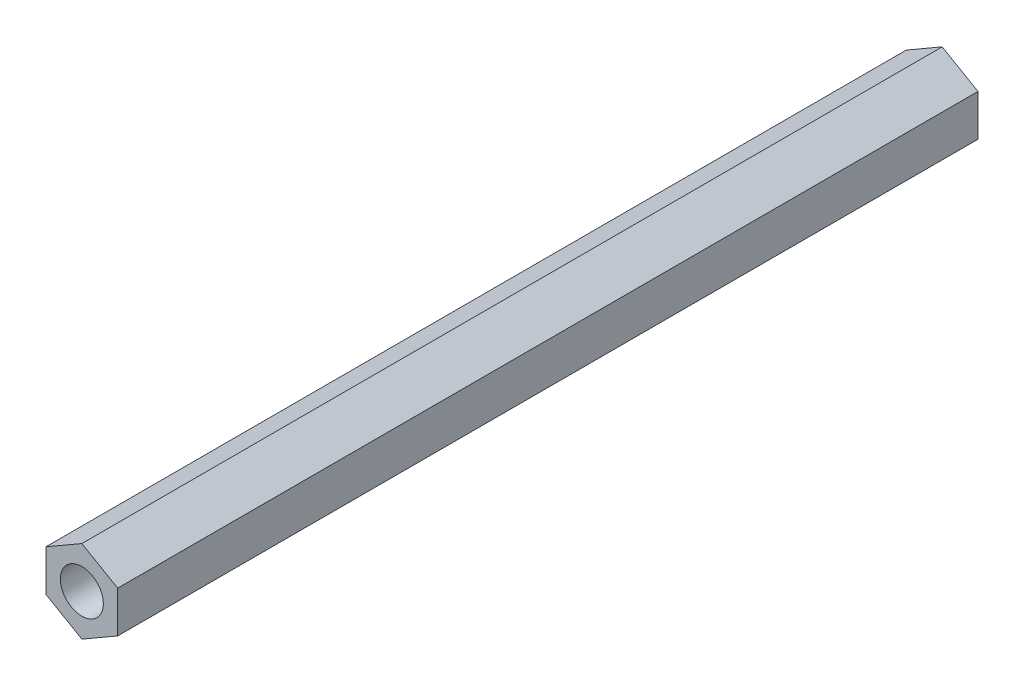
ISO-10303-21;
HEADER;
FILE_DESCRIPTION(('STEP AP214'),'2;1');
FILE_NAME('part.step','',(''),(''),'','','');
FILE_SCHEMA(('AUTOMOTIVE_DESIGN { 1 0 10303 214 1 1 1 1 }'));
ENDSEC;
DATA;
#1=APPLICATION_CONTEXT('core data for automotive mechanical design processes');
#2=APPLICATION_PROTOCOL_DEFINITION('international standard','automotive_design',2000,#1);
#3=PRODUCT_CONTEXT('',#1,'mechanical');
#4=PRODUCT('Part','Part','',(#3));
#5=PRODUCT_RELATED_PRODUCT_CATEGORY('part','',(#4));
#6=PRODUCT_DEFINITION_FORMATION('','',#4);
#7=PRODUCT_DEFINITION_CONTEXT('part definition',#1,'design');
#8=PRODUCT_DEFINITION('design','',#6,#7);
#9=PRODUCT_DEFINITION_SHAPE('','',#8);
#10=(LENGTH_UNIT() NAMED_UNIT(*) SI_UNIT(.MILLI.,.METRE.));
#11=(NAMED_UNIT(*) PLANE_ANGLE_UNIT() SI_UNIT($,.RADIAN.));
#12=(NAMED_UNIT(*) SI_UNIT($,.STERADIAN.) SOLID_ANGLE_UNIT());
#13=UNCERTAINTY_MEASURE_WITH_UNIT(LENGTH_MEASURE(1.E-05),#10,'distance_accuracy_value','');
#14=(GEOMETRIC_REPRESENTATION_CONTEXT(3) GLOBAL_UNCERTAINTY_ASSIGNED_CONTEXT((#13)) GLOBAL_UNIT_ASSIGNED_CONTEXT((#10,
#11,#12)) REPRESENTATION_CONTEXT('',''));
#15=CARTESIAN_POINT('',(0.,0.,0.));
#16=DIRECTION('',(0.,0.,1.));
#17=DIRECTION('',(1.,0.,0.));
#18=AXIS2_PLACEMENT_3D('',#15,#16,#17);
#19=CARTESIAN_POINT('',(0.,0.,60.));
#20=DIRECTION('',(0.,0.,1.));
#21=DIRECTION('',(1.,0.,0.));
#22=AXIS2_PLACEMENT_3D('',#19,#20,#21);
#23=PLANE('',#22);
#24=DIRECTION('',(-0.866025403784438,0.5,0.));
#25=VECTOR('',#24,1.);
#26=CARTESIAN_POINT('',(2.50000000000001,1.44337567297407,60.));
#27=LINE('',#26,#25);
#28=CARTESIAN_POINT('',(2.50000000000001,1.44337567297407,60.));
#29=VERTEX_POINT('',#28);
#30=CARTESIAN_POINT('',(0.,2.88675134594813,60.));
#31=VERTEX_POINT('',#30);
#32=EDGE_CURVE('E137',#29,#31,#27,.T.);
#33=ORIENTED_EDGE('',*,*,#32,.T.);
#34=DIRECTION('',(-0.866025403784439,-0.5,0.));
#35=VECTOR('',#34,1.);
#36=CARTESIAN_POINT('',(0.,2.88675134594813,60.));
#37=LINE('',#36,#35);
#38=CARTESIAN_POINT('',(-2.5,1.44337567297406,60.));
#39=VERTEX_POINT('',#38);
#40=EDGE_CURVE('E95',#31,#39,#37,.T.);
#41=ORIENTED_EDGE('',*,*,#40,.T.);
#42=DIRECTION('',(0.,-1.,0.));
#43=VECTOR('',#42,1.);
#44=CARTESIAN_POINT('',(-2.5,1.44337567297406,60.));
#45=LINE('',#44,#43);
#46=CARTESIAN_POINT('',(-2.5,-1.44337567297407,60.));
#47=VERTEX_POINT('',#46);
#48=EDGE_CURVE('E108',#39,#47,#45,.T.);
#49=ORIENTED_EDGE('',*,*,#48,.T.);
#50=DIRECTION('',(0.866025403784439,-0.5,0.));
#51=VECTOR('',#50,1.);
#52=CARTESIAN_POINT('',(-2.5,-1.44337567297407,60.));
#53=LINE('',#52,#51);
#54=CARTESIAN_POINT('',(0.,-2.88675134594813,60.));
#55=VERTEX_POINT('',#54);
#56=EDGE_CURVE('E102',#47,#55,#53,.T.);
#57=ORIENTED_EDGE('',*,*,#56,.T.);
#58=DIRECTION('',(0.866025403784439,0.5,0.));
#59=VECTOR('',#58,1.);
#60=CARTESIAN_POINT('',(0.,-2.88675134594813,60.));
#61=LINE('',#60,#59);
#62=CARTESIAN_POINT('',(2.50000000000001,-1.44337567297407,60.));
#63=VERTEX_POINT('',#62);
#64=EDGE_CURVE('E106',#55,#63,#61,.T.);
#65=ORIENTED_EDGE('',*,*,#64,.T.);
#66=DIRECTION('',(0.,1.,0.));
#67=VECTOR('',#66,1.);
#68=CARTESIAN_POINT('',(2.50000000000001,-1.44337567297407,60.));
#69=LINE('',#68,#67);
#70=EDGE_CURVE('E58',#63,#29,#69,.T.);
#71=ORIENTED_EDGE('',*,*,#70,.T.);
#72=EDGE_LOOP('',(#33,#41,#49,#57,#65,#71));
#73=FACE_BOUND('',#72,.T.);
#74=CARTESIAN_POINT('',(0.,0.,60.));
#75=DIRECTION('',(0.,0.,1.));
#76=DIRECTION('',(1.,0.,0.));
#77=AXIS2_PLACEMENT_3D('',#74,#75,#76);
#78=CIRCLE('',#77,1.5);
#79=CARTESIAN_POINT('',(1.5,0.,60.));
#80=VERTEX_POINT('',#79);
#81=EDGE_CURVE('E130',#80,#80,#78,.T.);
#82=ORIENTED_EDGE('',*,*,#81,.F.);
#83=EDGE_LOOP('',(#82));
#84=FACE_BOUND('',#83,.T.);
#85=ADVANCED_FACE('F41',(#73,#84),#23,.T.);
#86=CARTESIAN_POINT('',(0.,0.,0.));
#87=DIRECTION('',(0.,0.,1.));
#88=DIRECTION('',(1.,0.,0.));
#89=AXIS2_PLACEMENT_3D('',#86,#87,#88);
#90=PLANE('',#89);
#91=DIRECTION('',(-0.866025403784438,0.5,0.));
#92=VECTOR('',#91,1.);
#93=CARTESIAN_POINT('',(2.50000000000001,1.44337567297407,0.));
#94=LINE('',#93,#92);
#95=CARTESIAN_POINT('',(2.50000000000001,1.44337567297407,0.));
#96=VERTEX_POINT('',#95);
#97=CARTESIAN_POINT('',(0.,2.88675134594813,0.));
#98=VERTEX_POINT('',#97);
#99=EDGE_CURVE('E126',#96,#98,#94,.T.);
#100=ORIENTED_EDGE('',*,*,#99,.F.);
#101=DIRECTION('',(0.,1.,0.));
#102=VECTOR('',#101,1.);
#103=CARTESIAN_POINT('',(2.50000000000001,-1.44337567297407,0.));
#104=LINE('',#103,#102);
#105=CARTESIAN_POINT('',(2.50000000000001,-1.44337567297407,0.));
#106=VERTEX_POINT('',#105);
#107=EDGE_CURVE('E87',#106,#96,#104,.T.);
#108=ORIENTED_EDGE('',*,*,#107,.F.);
#109=DIRECTION('',(0.866025403784439,0.5,0.));
#110=VECTOR('',#109,1.);
#111=CARTESIAN_POINT('',(0.,-2.88675134594813,0.));
#112=LINE('',#111,#110);
#113=CARTESIAN_POINT('',(0.,-2.88675134594813,0.));
#114=VERTEX_POINT('',#113);
#115=EDGE_CURVE('E81',#114,#106,#112,.T.);
#116=ORIENTED_EDGE('',*,*,#115,.F.);
#117=DIRECTION('',(0.866025403784439,-0.5,0.));
#118=VECTOR('',#117,1.);
#119=CARTESIAN_POINT('',(-2.5,-1.44337567297407,0.));
#120=LINE('',#119,#118);
#121=CARTESIAN_POINT('',(-2.5,-1.44337567297407,0.));
#122=VERTEX_POINT('',#121);
#123=EDGE_CURVE('E116',#122,#114,#120,.T.);
#124=ORIENTED_EDGE('',*,*,#123,.F.);
#125=DIRECTION('',(0.,-1.,0.));
#126=VECTOR('',#125,1.);
#127=CARTESIAN_POINT('',(-2.5,1.44337567297406,0.));
#128=LINE('',#127,#126);
#129=CARTESIAN_POINT('',(-2.5,1.44337567297406,0.));
#130=VERTEX_POINT('',#129);
#131=EDGE_CURVE('E132',#130,#122,#128,.T.);
#132=ORIENTED_EDGE('',*,*,#131,.F.);
#133=DIRECTION('',(-0.866025403784439,-0.5,0.));
#134=VECTOR('',#133,1.);
#135=CARTESIAN_POINT('',(0.,2.88675134594813,0.));
#136=LINE('',#135,#134);
#137=EDGE_CURVE('E129',#98,#130,#136,.T.);
#138=ORIENTED_EDGE('',*,*,#137,.F.);
#139=EDGE_LOOP('',(#100,#108,#116,#124,#132,#138));
#140=FACE_BOUND('',#139,.T.);
#141=CARTESIAN_POINT('',(0.,0.,0.));
#142=DIRECTION('',(0.,0.,1.));
#143=DIRECTION('',(1.,0.,0.));
#144=AXIS2_PLACEMENT_3D('',#141,#142,#143);
#145=CIRCLE('',#144,1.5);
#146=CARTESIAN_POINT('',(1.5,0.,0.));
#147=VERTEX_POINT('',#146);
#148=EDGE_CURVE('E230',#147,#147,#145,.T.);
#149=ORIENTED_EDGE('',*,*,#148,.T.);
#150=EDGE_LOOP('',(#149));
#151=FACE_BOUND('',#150,.T.);
#152=ADVANCED_FACE('F146',(#140,#151),#90,.F.);
#153=CARTESIAN_POINT('',(2.50000000000001,1.44337567297407,60.));
#154=DIRECTION('',(-0.5,-0.866025403784439,0.));
#155=DIRECTION('',(0.866025403784439,-0.5,0.));
#156=AXIS2_PLACEMENT_3D('',#153,#154,#155);
#157=PLANE('',#156);
#158=ORIENTED_EDGE('',*,*,#99,.T.);
#159=DIRECTION('',(0.,0.,-1.));
#160=VECTOR('',#159,1.);
#161=CARTESIAN_POINT('',(0.,2.88675134594813,60.));
#162=LINE('',#161,#160);
#163=EDGE_CURVE('E11',#31,#98,#162,.T.);
#164=ORIENTED_EDGE('',*,*,#163,.F.);
#165=ORIENTED_EDGE('',*,*,#32,.F.);
#166=DIRECTION('',(0.,0.,-1.));
#167=VECTOR('',#166,1.);
#168=CARTESIAN_POINT('',(2.50000000000001,1.44337567297407,60.));
#169=LINE('',#168,#167);
#170=EDGE_CURVE('E122',#29,#96,#169,.T.);
#171=ORIENTED_EDGE('',*,*,#170,.T.);
#172=EDGE_LOOP('',(#158,#164,#165,#171));
#173=FACE_BOUND('',#172,.T.);
#174=ADVANCED_FACE('F43',(#173),#157,.F.);
#175=CARTESIAN_POINT('',(0.,2.88675134594813,60.));
#176=DIRECTION('',(0.5,-0.866025403784439,0.));
#177=DIRECTION('',(0.866025403784439,0.5,0.));
#178=AXIS2_PLACEMENT_3D('',#175,#176,#177);
#179=PLANE('',#178);
#180=ORIENTED_EDGE('',*,*,#137,.T.);
#181=DIRECTION('',(0.,0.,-1.));
#182=VECTOR('',#181,1.);
#183=CARTESIAN_POINT('',(-2.5,1.44337567297406,60.));
#184=LINE('',#183,#182);
#185=EDGE_CURVE('E50',#39,#130,#184,.T.);
#186=ORIENTED_EDGE('',*,*,#185,.F.);
#187=ORIENTED_EDGE('',*,*,#40,.F.);
#188=ORIENTED_EDGE('',*,*,#163,.T.);
#189=EDGE_LOOP('',(#180,#186,#187,#188));
#190=FACE_BOUND('',#189,.T.);
#191=ADVANCED_FACE('F171',(#190),#179,.F.);
#192=CARTESIAN_POINT('',(-2.5,1.44337567297406,60.));
#193=DIRECTION('',(1.,0.,0.));
#194=DIRECTION('',(0.,0.,-1.));
#195=AXIS2_PLACEMENT_3D('',#192,#193,#194);
#196=PLANE('',#195);
#197=ORIENTED_EDGE('',*,*,#131,.T.);
#198=DIRECTION('',(0.,0.,-1.));
#199=VECTOR('',#198,1.);
#200=CARTESIAN_POINT('',(-2.5,-1.44337567297407,60.));
#201=LINE('',#200,#199);
#202=EDGE_CURVE('E117',#47,#122,#201,.T.);
#203=ORIENTED_EDGE('',*,*,#202,.F.);
#204=ORIENTED_EDGE('',*,*,#48,.F.);
#205=ORIENTED_EDGE('',*,*,#185,.T.);
#206=EDGE_LOOP('',(#197,#203,#204,#205));
#207=FACE_BOUND('',#206,.T.);
#208=ADVANCED_FACE('F143',(#207),#196,.F.);
#209=CARTESIAN_POINT('',(-2.5,-1.44337567297407,60.));
#210=DIRECTION('',(0.5,0.866025403784439,0.));
#211=DIRECTION('',(-0.866025403784439,0.5,0.));
#212=AXIS2_PLACEMENT_3D('',#209,#210,#211);
#213=PLANE('',#212);
#214=ORIENTED_EDGE('',*,*,#123,.T.);
#215=DIRECTION('',(0.,0.,-1.));
#216=VECTOR('',#215,1.);
#217=CARTESIAN_POINT('',(0.,-2.88675134594813,60.));
#218=LINE('',#217,#216);
#219=EDGE_CURVE('E113',#55,#114,#218,.T.);
#220=ORIENTED_EDGE('',*,*,#219,.F.);
#221=ORIENTED_EDGE('',*,*,#56,.F.);
#222=ORIENTED_EDGE('',*,*,#202,.T.);
#223=EDGE_LOOP('',(#214,#220,#221,#222));
#224=FACE_BOUND('',#223,.T.);
#225=ADVANCED_FACE('F114',(#224),#213,.F.);
#226=CARTESIAN_POINT('',(0.,-2.88675134594813,60.));
#227=DIRECTION('',(-0.5,0.866025403784439,0.));
#228=DIRECTION('',(-0.866025403784439,-0.5,0.));
#229=AXIS2_PLACEMENT_3D('',#226,#227,#228);
#230=PLANE('',#229);
#231=ORIENTED_EDGE('',*,*,#115,.T.);
#232=DIRECTION('',(0.,0.,-1.));
#233=VECTOR('',#232,1.);
#234=CARTESIAN_POINT('',(2.50000000000001,-1.44337567297407,60.));
#235=LINE('',#234,#233);
#236=EDGE_CURVE('E118',#63,#106,#235,.T.);
#237=ORIENTED_EDGE('',*,*,#236,.F.);
#238=ORIENTED_EDGE('',*,*,#64,.F.);
#239=ORIENTED_EDGE('',*,*,#219,.T.);
#240=EDGE_LOOP('',(#231,#237,#238,#239));
#241=FACE_BOUND('',#240,.T.);
#242=ADVANCED_FACE('F120',(#241),#230,.F.);
#243=CARTESIAN_POINT('',(2.50000000000001,-1.44337567297407,60.));
#244=DIRECTION('',(-1.,0.,0.));
#245=DIRECTION('',(0.,0.,1.));
#246=AXIS2_PLACEMENT_3D('',#243,#244,#245);
#247=PLANE('',#246);
#248=ORIENTED_EDGE('',*,*,#107,.T.);
#249=ORIENTED_EDGE('',*,*,#170,.F.);
#250=ORIENTED_EDGE('',*,*,#70,.F.);
#251=ORIENTED_EDGE('',*,*,#236,.T.);
#252=EDGE_LOOP('',(#248,#249,#250,#251));
#253=FACE_BOUND('',#252,.T.);
#254=ADVANCED_FACE('F151',(#253),#247,.F.);
#255=CARTESIAN_POINT('',(0.,0.,60.));
#256=DIRECTION('',(0.,0.,-1.));
#257=DIRECTION('',(-1.,0.,0.));
#258=AXIS2_PLACEMENT_3D('',#255,#256,#257);
#259=CYLINDRICAL_SURFACE('',#258,1.5);
#260=ORIENTED_EDGE('',*,*,#81,.T.);
#261=EDGE_LOOP('',(#260));
#262=FACE_BOUND('',#261,.T.);
#263=ORIENTED_EDGE('',*,*,#148,.F.);
#264=EDGE_LOOP('',(#263));
#265=FACE_BOUND('',#264,.T.);
#266=ADVANCED_FACE('F153',(#262,#265),#259,.F.);
#267=CLOSED_SHELL('',(#85,#152,#174,#191,#208,#225,#242,#254,#266));
#268=MANIFOLD_SOLID_BREP('B2',#267);
#269=ADVANCED_BREP_SHAPE_REPRESENTATION('',(#18,#268),#14);
#270=SHAPE_DEFINITION_REPRESENTATION(#9,#269);
ENDSEC;
END-ISO-10303-21;
